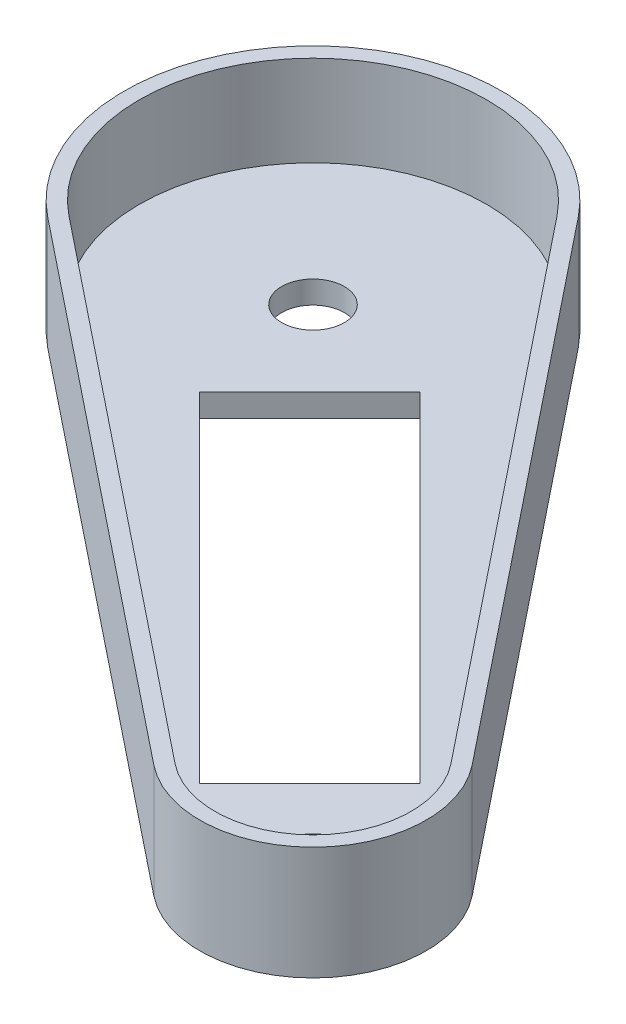
ISO-10303-21;
HEADER;
FILE_DESCRIPTION(('STEP AP214'),'2;1');
FILE_NAME('part.step','',(''),(''),'','','');
FILE_SCHEMA(('AUTOMOTIVE_DESIGN { 1 0 10303 214 1 1 1 1 }'));
ENDSEC;
DATA;
#1=APPLICATION_CONTEXT('core data for automotive mechanical design processes');
#2=APPLICATION_PROTOCOL_DEFINITION('international standard','automotive_design',2000,#1);
#3=PRODUCT_CONTEXT('',#1,'mechanical');
#4=PRODUCT('Part','Part','',(#3));
#5=PRODUCT_RELATED_PRODUCT_CATEGORY('part','',(#4));
#6=PRODUCT_DEFINITION_FORMATION('','',#4);
#7=PRODUCT_DEFINITION_CONTEXT('part definition',#1,'design');
#8=PRODUCT_DEFINITION('design','',#6,#7);
#9=PRODUCT_DEFINITION_SHAPE('','',#8);
#10=(LENGTH_UNIT() NAMED_UNIT(*) SI_UNIT(.MILLI.,.METRE.));
#11=(NAMED_UNIT(*) PLANE_ANGLE_UNIT() SI_UNIT($,.RADIAN.));
#12=(NAMED_UNIT(*) SI_UNIT($,.STERADIAN.) SOLID_ANGLE_UNIT());
#13=UNCERTAINTY_MEASURE_WITH_UNIT(LENGTH_MEASURE(1.E-05),#10,'distance_accuracy_value','');
#14=(GEOMETRIC_REPRESENTATION_CONTEXT(3) GLOBAL_UNCERTAINTY_ASSIGNED_CONTEXT((#13)) GLOBAL_UNIT_ASSIGNED_CONTEXT((#10,
#11,#12)) REPRESENTATION_CONTEXT('',''));
#15=CARTESIAN_POINT('',(0.,0.,0.));
#16=DIRECTION('',(0.,0.,1.));
#17=DIRECTION('',(1.,0.,0.));
#18=AXIS2_PLACEMENT_3D('',#15,#16,#17);
#19=CARTESIAN_POINT('',(-15.6040237198615,3.,19.5323947264538));
#20=DIRECTION('',(0.624160948794458,0.,-0.781295789058153));
#21=DIRECTION('',(-0.781295789058153,0.,-0.624160948794458));
#22=AXIS2_PLACEMENT_3D('',#19,#20,#21);
#23=PLANE('',#22);
#24=DIRECTION('',(0.781295789058153,0.,0.624160948794458));
#25=VECTOR('',#24,1.);
#26=CARTESIAN_POINT('',(-15.6040237198615,0.,19.5323947264538));
#27=LINE('',#26,#25);
#28=CARTESIAN_POINT('',(-15.6040237198615,0.,19.5323947264538));
#29=VERTEX_POINT('',#28);
#30=CARTESIAN_POINT('',(54.2771960748732,0.,75.3590471426608));
#31=VERTEX_POINT('',#30);
#32=EDGE_CURVE('E244',#29,#31,#27,.T.);
#33=ORIENTED_EDGE('',*,*,#32,.T.);
#34=DIRECTION('',(0.,-1.,0.));
#35=VECTOR('',#34,1.);
#36=CARTESIAN_POINT('',(54.2771960748732,3.,75.3590471426608));
#37=LINE('',#36,#35);
#38=CARTESIAN_POINT('',(54.2771960748732,15.,75.3590471426608));
#39=VERTEX_POINT('',#38);
#40=EDGE_CURVE('E11',#39,#31,#37,.T.);
#41=ORIENTED_EDGE('',*,*,#40,.F.);
#42=DIRECTION('',(0.781295789058153,0.,0.624160948794458));
#43=VECTOR('',#42,1.);
#44=CARTESIAN_POINT('',(-15.6040237198615,15.,19.5323947264538));
#45=LINE('',#44,#43);
#46=CARTESIAN_POINT('',(-15.6040237198615,15.,19.5323947264538));
#47=VERTEX_POINT('',#46);
#48=EDGE_CURVE('E201',#47,#39,#45,.T.);
#49=ORIENTED_EDGE('',*,*,#48,.F.);
#50=DIRECTION('',(0.,-1.,0.));
#51=VECTOR('',#50,1.);
#52=CARTESIAN_POINT('',(-15.6040237198615,3.,19.5323947264538));
#53=LINE('',#52,#51);
#54=EDGE_CURVE('E254',#47,#29,#53,.T.);
#55=ORIENTED_EDGE('',*,*,#54,.T.);
#56=EDGE_LOOP('',(#33,#41,#49,#55));
#57=FACE_BOUND('',#56,.T.);
#58=ADVANCED_FACE('F47',(#57),#23,.F.);
#59=CARTESIAN_POINT('',(63.6396103067901,3.,63.6396103067885));
#60=DIRECTION('',(0.,-1.,0.));
#61=DIRECTION('',(0.,0.,-1.));
#62=AXIS2_PLACEMENT_3D('',#59,#60,#61);
#63=CYLINDRICAL_SURFACE('',#62,15.);
#64=CARTESIAN_POINT('',(63.6396103067901,0.,63.6396103067885));
#65=DIRECTION('',(0.,1.,0.));
#66=DIRECTION('',(0.,0.,1.));
#67=AXIS2_PLACEMENT_3D('',#64,#65,#66);
#68=CIRCLE('',#67,15.);
#69=CARTESIAN_POINT('',(75.3590471426621,0.,54.2771960748713));
#70=VERTEX_POINT('',#69);
#71=EDGE_CURVE('E258',#31,#70,#68,.T.);
#72=ORIENTED_EDGE('',*,*,#71,.T.);
#73=DIRECTION('',(0.,-1.,0.));
#74=VECTOR('',#73,1.);
#75=CARTESIAN_POINT('',(75.3590471426621,3.,54.2771960748713));
#76=LINE('',#75,#74);
#77=CARTESIAN_POINT('',(75.3590471426621,15.,54.2771960748713));
#78=VERTEX_POINT('',#77);
#79=EDGE_CURVE('E55',#78,#70,#76,.T.);
#80=ORIENTED_EDGE('',*,*,#79,.F.);
#81=CARTESIAN_POINT('',(63.6396103067901,15.,63.6396103067885));
#82=DIRECTION('',(0.,1.,0.));
#83=DIRECTION('',(0.,0.,1.));
#84=AXIS2_PLACEMENT_3D('',#81,#82,#83);
#85=CIRCLE('',#84,15.);
#86=EDGE_CURVE('E205',#39,#78,#85,.T.);
#87=ORIENTED_EDGE('',*,*,#86,.F.);
#88=ORIENTED_EDGE('',*,*,#40,.T.);
#89=EDGE_LOOP('',(#72,#80,#87,#88));
#90=FACE_BOUND('',#89,.T.);
#91=ADVANCED_FACE('F288',(#90),#63,.T.);
#92=CARTESIAN_POINT('',(19.5323947264534,3.,-15.6040237198619));
#93=DIRECTION('',(0.781295789058138,0.,-0.624160948794477));
#94=DIRECTION('',(-0.624160948794477,0.,-0.781295789058138));
#95=AXIS2_PLACEMENT_3D('',#92,#93,#94);
#96=PLANE('',#95);
#97=DIRECTION('',(0.624160948794477,0.,0.781295789058138));
#98=VECTOR('',#97,1.);
#99=CARTESIAN_POINT('',(19.5323947264534,0.,-15.6040237198619));
#100=LINE('',#99,#98);
#101=CARTESIAN_POINT('',(19.5323947264534,0.,-15.6040237198619));
#102=VERTEX_POINT('',#101);
#103=EDGE_CURVE('E262',#102,#70,#100,.T.);
#104=ORIENTED_EDGE('',*,*,#103,.F.);
#105=DIRECTION('',(0.,-1.,0.));
#106=VECTOR('',#105,1.);
#107=CARTESIAN_POINT('',(19.5323947264534,3.,-15.6040237198619));
#108=LINE('',#107,#106);
#109=CARTESIAN_POINT('',(19.5323947264534,15.,-15.6040237198619));
#110=VERTEX_POINT('',#109);
#111=EDGE_CURVE('E279',#110,#102,#108,.T.);
#112=ORIENTED_EDGE('',*,*,#111,.F.);
#113=DIRECTION('',(-0.624160948794477,0.,-0.781295789058138));
#114=VECTOR('',#113,1.);
#115=CARTESIAN_POINT('',(19.5323947264534,15.,-15.6040237198619));
#116=LINE('',#115,#114);
#117=EDGE_CURVE('E209',#78,#110,#116,.T.);
#118=ORIENTED_EDGE('',*,*,#117,.F.);
#119=ORIENTED_EDGE('',*,*,#79,.T.);
#120=EDGE_LOOP('',(#104,#112,#118,#119));
#121=FACE_BOUND('',#120,.T.);
#122=ADVANCED_FACE('F285',(#121),#96,.T.);
#123=CARTESIAN_POINT('',(63.6396103067901,3.,63.6396103067885));
#124=DIRECTION('',(0.,-1.,0.));
#125=DIRECTION('',(0.,0.,-1.));
#126=AXIS2_PLACEMENT_3D('',#123,#124,#125);
#127=CYLINDRICAL_SURFACE('',#126,4.15);
#128=CARTESIAN_POINT('',(63.6396103067901,3.,63.6396103067885));
#129=DIRECTION('',(0.,1.,0.));
#130=DIRECTION('',(0.,0.,1.));
#131=AXIS2_PLACEMENT_3D('',#128,#129,#130);
#132=CIRCLE('',#131,4.15);
#133=CARTESIAN_POINT('',(63.6396103067901,3.,67.7896103067885));
#134=VERTEX_POINT('',#133);
#135=EDGE_CURVE('E245',#134,#134,#132,.T.);
#136=ORIENTED_EDGE('',*,*,#135,.T.);
#137=EDGE_LOOP('',(#136));
#138=FACE_BOUND('',#137,.T.);
#139=CARTESIAN_POINT('',(63.6396103067901,0.,63.6396103067885));
#140=DIRECTION('',(0.,1.,0.));
#141=DIRECTION('',(0.,0.,1.));
#142=AXIS2_PLACEMENT_3D('',#139,#140,#141);
#143=CIRCLE('',#142,4.15);
#144=CARTESIAN_POINT('',(63.6396103067901,0.,67.7896103067885));
#145=VERTEX_POINT('',#144);
#146=EDGE_CURVE('E269',#145,#145,#143,.T.);
#147=ORIENTED_EDGE('',*,*,#146,.F.);
#148=EDGE_LOOP('',(#147));
#149=FACE_BOUND('',#148,.T.);
#150=ADVANCED_FACE('F321',(#138,#149),#127,.F.);
#151=CARTESIAN_POINT('',(0.,3.,0.));
#152=DIRECTION('',(0.,-1.,0.));
#153=DIRECTION('',(0.,0.,-1.));
#154=AXIS2_PLACEMENT_3D('',#151,#152,#153);
#155=CYLINDRICAL_SURFACE('',#154,25.);
#156=CARTESIAN_POINT('',(0.,0.,0.));
#157=DIRECTION('',(0.,1.,0.));
#158=DIRECTION('',(0.,0.,1.));
#159=AXIS2_PLACEMENT_3D('',#156,#157,#158);
#160=CIRCLE('',#159,25.);
#161=EDGE_CURVE('E266',#102,#29,#160,.T.);
#162=ORIENTED_EDGE('',*,*,#161,.T.);
#163=ORIENTED_EDGE('',*,*,#54,.F.);
#164=CARTESIAN_POINT('',(0.,15.,0.));
#165=DIRECTION('',(0.,1.,0.));
#166=DIRECTION('',(0.,0.,1.));
#167=AXIS2_PLACEMENT_3D('',#164,#165,#166);
#168=CIRCLE('',#167,25.);
#169=EDGE_CURVE('E213',#110,#47,#168,.T.);
#170=ORIENTED_EDGE('',*,*,#169,.F.);
#171=ORIENTED_EDGE('',*,*,#111,.T.);
#172=EDGE_LOOP('',(#162,#163,#170,#171));
#173=FACE_BOUND('',#172,.T.);
#174=ADVANCED_FACE('F293',(#173),#155,.T.);
#175=CARTESIAN_POINT('',(0.,3.,0.));
#176=DIRECTION('',(0.,-1.,0.));
#177=DIRECTION('',(0.,0.,-1.));
#178=AXIS2_PLACEMENT_3D('',#175,#176,#177);
#179=CYLINDRICAL_SURFACE('',#178,4.15);
#180=CARTESIAN_POINT('',(0.,3.,0.));
#181=DIRECTION('',(0.,1.,0.));
#182=DIRECTION('',(0.,0.,1.));
#183=AXIS2_PLACEMENT_3D('',#180,#181,#182);
#184=CIRCLE('',#183,4.15);
#185=CARTESIAN_POINT('',(0.,3.,4.15));
#186=VERTEX_POINT('',#185);
#187=EDGE_CURVE('E249',#186,#186,#184,.T.);
#188=ORIENTED_EDGE('',*,*,#187,.T.);
#189=EDGE_LOOP('',(#188));
#190=FACE_BOUND('',#189,.T.);
#191=CARTESIAN_POINT('',(0.,0.,0.));
#192=DIRECTION('',(0.,1.,0.));
#193=DIRECTION('',(0.,0.,1.));
#194=AXIS2_PLACEMENT_3D('',#191,#192,#193);
#195=CIRCLE('',#194,4.15);
#196=CARTESIAN_POINT('',(0.,0.,4.15));
#197=VERTEX_POINT('',#196);
#198=EDGE_CURVE('E250',#197,#197,#195,.T.);
#199=ORIENTED_EDGE('',*,*,#198,.F.);
#200=EDGE_LOOP('',(#199));
#201=FACE_BOUND('',#200,.T.);
#202=ADVANCED_FACE('F326',(#190,#201),#179,.F.);
#203=CARTESIAN_POINT('',(0.,3.,0.));
#204=DIRECTION('',(0.,1.,0.));
#205=DIRECTION('',(0.,0.,1.));
#206=AXIS2_PLACEMENT_3D('',#203,#204,#205);
#207=PLANE('',#206);
#208=DIRECTION('',(-0.707106781186556,0.,-0.707106781186539));
#209=VECTOR('',#208,1.);
#210=CARTESIAN_POINT('',(7.07833510875965,3.,-7.07833510875982));
#211=LINE('',#210,#209);
#212=CARTESIAN_POINT('',(61.9879543253394,3.,47.8312841078186));
#213=VERTEX_POINT('',#212);
#214=CARTESIAN_POINT('',(17.1336623729859,3.,2.97699215546623));
#215=VERTEX_POINT('',#214);
#216=EDGE_CURVE('E62',#213,#215,#211,.T.);
#217=ORIENTED_EDGE('',*,*,#216,.F.);
#218=DIRECTION('',(0.707106781186539,0.,-0.707106781186556));
#219=VECTOR('',#218,1.);
#220=CARTESIAN_POINT('',(54.9096192165797,3.,54.9096192165784));
#221=LINE('',#220,#219);
#222=CARTESIAN_POINT('',(47.3842313641089,3.,62.4350070690494));
#223=VERTEX_POINT('',#222);
#224=EDGE_CURVE('E157',#223,#213,#221,.T.);
#225=ORIENTED_EDGE('',*,*,#224,.F.);
#226=DIRECTION('',(0.707106781186556,0.,0.707106781186539));
#227=VECTOR('',#226,1.);
#228=CARTESIAN_POINT('',(-7.52538785247084,3.,7.52538785247103));
#229=LINE('',#228,#227);
#230=CARTESIAN_POINT('',(2.52993941175545,3.,17.5807151166971));
#231=VERTEX_POINT('',#230);
#232=EDGE_CURVE('E161',#231,#223,#229,.T.);
#233=ORIENTED_EDGE('',*,*,#232,.F.);
#234=DIRECTION('',(-0.707106781186539,0.,0.707106781186556));
#235=VECTOR('',#234,1.);
#236=CARTESIAN_POINT('',(10.0553272642263,3.,10.055327264226));
#237=LINE('',#236,#235);
#238=EDGE_CURVE('E170',#215,#231,#237,.T.);
#239=ORIENTED_EDGE('',*,*,#238,.F.);
#240=EDGE_LOOP('',(#217,#225,#233,#239));
#241=FACE_BOUND('',#240,.T.);
#242=CARTESIAN_POINT('',(63.6396103067901,3.,63.6396103067885));
#243=DIRECTION('',(0.,1.,0.));
#244=DIRECTION('',(0.,0.,1.));
#245=AXIS2_PLACEMENT_3D('',#242,#243,#244);
#246=CIRCLE('',#245,13.);
#247=CARTESIAN_POINT('',(55.5255179724621,3.,73.7964555645445));
#248=VERTEX_POINT('',#247);
#249=CARTESIAN_POINT('',(73.7964555645458,3.,55.5255179724603));
#250=VERTEX_POINT('',#249);
#251=EDGE_CURVE('E221',#248,#250,#246,.T.);
#252=ORIENTED_EDGE('',*,*,#251,.T.);
#253=DIRECTION('',(0.624160948794477,0.,0.781295789058138));
#254=VECTOR('',#253,1.);
#255=CARTESIAN_POINT('',(17.9698031483372,3.,-14.355701822273));
#256=LINE('',#255,#254);
#257=CARTESIAN_POINT('',(17.9698031483372,3.,-14.355701822273));
#258=VERTEX_POINT('',#257);
#259=EDGE_CURVE('E179',#258,#250,#256,.T.);
#260=ORIENTED_EDGE('',*,*,#259,.F.);
#261=CARTESIAN_POINT('',(0.,3.,0.));
#262=DIRECTION('',(0.,1.,0.));
#263=DIRECTION('',(0.,0.,1.));
#264=AXIS2_PLACEMENT_3D('',#261,#262,#263);
#265=CIRCLE('',#264,23.);
#266=CARTESIAN_POINT('',(-14.3557018222725,3.,17.9698031483375));
#267=VERTEX_POINT('',#266);
#268=EDGE_CURVE('E189',#258,#267,#265,.T.);
#269=ORIENTED_EDGE('',*,*,#268,.T.);
#270=DIRECTION('',(0.781295789058153,0.,0.624160948794458));
#271=VECTOR('',#270,1.);
#272=CARTESIAN_POINT('',(-14.3557018222725,3.,17.9698031483375));
#273=LINE('',#272,#271);
#274=EDGE_CURVE('E224',#267,#248,#273,.T.);
#275=ORIENTED_EDGE('',*,*,#274,.T.);
#276=EDGE_LOOP('',(#252,#260,#269,#275));
#277=FACE_BOUND('',#276,.T.);
#278=ORIENTED_EDGE('',*,*,#135,.F.);
#279=EDGE_LOOP('',(#278));
#280=FACE_BOUND('',#279,.T.);
#281=ORIENTED_EDGE('',*,*,#187,.F.);
#282=EDGE_LOOP('',(#281));
#283=FACE_BOUND('',#282,.T.);
#284=ADVANCED_FACE('F331',(#241,#277,#280,#283),#207,.T.);
#285=CARTESIAN_POINT('',(0.,0.,0.));
#286=DIRECTION('',(0.,1.,0.));
#287=DIRECTION('',(0.,0.,1.));
#288=AXIS2_PLACEMENT_3D('',#285,#286,#287);
#289=PLANE('',#288);
#290=DIRECTION('',(0.707106781186539,0.,-0.707106781186556));
#291=VECTOR('',#290,1.);
#292=CARTESIAN_POINT('',(54.9096192165797,0.,54.9096192165784));
#293=LINE('',#292,#291);
#294=CARTESIAN_POINT('',(47.3842313641089,0.,62.4350070690494));
#295=VERTEX_POINT('',#294);
#296=CARTESIAN_POINT('',(61.9879543253394,0.,47.8312841078186));
#297=VERTEX_POINT('',#296);
#298=EDGE_CURVE('E145',#295,#297,#293,.T.);
#299=ORIENTED_EDGE('',*,*,#298,.T.);
#300=DIRECTION('',(-0.707106781186556,0.,-0.707106781186539));
#301=VECTOR('',#300,1.);
#302=CARTESIAN_POINT('',(7.07833510875965,0.,-7.07833510875982));
#303=LINE('',#302,#301);
#304=CARTESIAN_POINT('',(17.1336623729859,0.,2.97699215546623));
#305=VERTEX_POINT('',#304);
#306=EDGE_CURVE('E138',#297,#305,#303,.T.);
#307=ORIENTED_EDGE('',*,*,#306,.T.);
#308=DIRECTION('',(-0.707106781186539,0.,0.707106781186556));
#309=VECTOR('',#308,1.);
#310=CARTESIAN_POINT('',(10.0553272642263,0.,10.055327264226));
#311=LINE('',#310,#309);
#312=CARTESIAN_POINT('',(2.52993941175545,0.,17.5807151166971));
#313=VERTEX_POINT('',#312);
#314=EDGE_CURVE('E148',#305,#313,#311,.T.);
#315=ORIENTED_EDGE('',*,*,#314,.T.);
#316=DIRECTION('',(0.707106781186556,0.,0.707106781186539));
#317=VECTOR('',#316,1.);
#318=CARTESIAN_POINT('',(-7.52538785247084,0.,7.52538785247103));
#319=LINE('',#318,#317);
#320=EDGE_CURVE('E70',#313,#295,#319,.T.);
#321=ORIENTED_EDGE('',*,*,#320,.T.);
#322=EDGE_LOOP('',(#299,#307,#315,#321));
#323=FACE_BOUND('',#322,.T.);
#324=ORIENTED_EDGE('',*,*,#32,.F.);
#325=ORIENTED_EDGE('',*,*,#161,.F.);
#326=ORIENTED_EDGE('',*,*,#103,.T.);
#327=ORIENTED_EDGE('',*,*,#71,.F.);
#328=EDGE_LOOP('',(#324,#325,#326,#327));
#329=FACE_BOUND('',#328,.T.);
#330=ORIENTED_EDGE('',*,*,#146,.T.);
#331=EDGE_LOOP('',(#330));
#332=FACE_BOUND('',#331,.T.);
#333=ORIENTED_EDGE('',*,*,#198,.T.);
#334=EDGE_LOOP('',(#333));
#335=FACE_BOUND('',#334,.T.);
#336=ADVANCED_FACE('F153',(#323,#329,#332,#335),#289,.F.);
#337=CARTESIAN_POINT('',(17.9698031483372,15.,-14.355701822273));
#338=DIRECTION('',(0.781295789058137,0.,-0.624160948794477));
#339=DIRECTION('',(-0.624160948794477,0.,-0.781295789058137));
#340=AXIS2_PLACEMENT_3D('',#337,#338,#339);
#341=PLANE('',#340);
#342=ORIENTED_EDGE('',*,*,#259,.T.);
#343=DIRECTION('',(0.,-1.,0.));
#344=VECTOR('',#343,1.);
#345=CARTESIAN_POINT('',(73.7964555645459,15.,55.5255179724603));
#346=LINE('',#345,#344);
#347=CARTESIAN_POINT('',(73.7964555645459,15.,55.5255179724603));
#348=VERTEX_POINT('',#347);
#349=EDGE_CURVE('E240',#348,#250,#346,.T.);
#350=ORIENTED_EDGE('',*,*,#349,.F.);
#351=DIRECTION('',(0.624160948794477,0.,0.781295789058138));
#352=VECTOR('',#351,1.);
#353=CARTESIAN_POINT('',(17.9698031483372,15.,-14.355701822273));
#354=LINE('',#353,#352);
#355=CARTESIAN_POINT('',(17.9698031483372,15.,-14.355701822273));
#356=VERTEX_POINT('',#355);
#357=EDGE_CURVE('E185',#356,#348,#354,.T.);
#358=ORIENTED_EDGE('',*,*,#357,.F.);
#359=DIRECTION('',(0.,-1.,0.));
#360=VECTOR('',#359,1.);
#361=CARTESIAN_POINT('',(17.9698031483372,15.,-14.355701822273));
#362=LINE('',#361,#360);
#363=EDGE_CURVE('E217',#356,#258,#362,.T.);
#364=ORIENTED_EDGE('',*,*,#363,.T.);
#365=EDGE_LOOP('',(#342,#350,#358,#364));
#366=FACE_BOUND('',#365,.T.);
#367=ADVANCED_FACE('F335',(#366),#341,.F.);
#368=CARTESIAN_POINT('',(63.6396103067901,15.,63.6396103067885));
#369=DIRECTION('',(0.,-1.,0.));
#370=DIRECTION('',(0.,0.,-1.));
#371=AXIS2_PLACEMENT_3D('',#368,#369,#370);
#372=CYLINDRICAL_SURFACE('',#371,13.);
#373=ORIENTED_EDGE('',*,*,#251,.F.);
#374=DIRECTION('',(0.,-1.,0.));
#375=VECTOR('',#374,1.);
#376=CARTESIAN_POINT('',(55.5255179724621,15.,73.7964555645445));
#377=LINE('',#376,#375);
#378=CARTESIAN_POINT('',(55.5255179724621,15.,73.7964555645445));
#379=VERTEX_POINT('',#378);
#380=EDGE_CURVE('E236',#379,#248,#377,.T.);
#381=ORIENTED_EDGE('',*,*,#380,.F.);
#382=CARTESIAN_POINT('',(63.6396103067901,15.,63.6396103067885));
#383=DIRECTION('',(0.,1.,0.));
#384=DIRECTION('',(0.,0.,1.));
#385=AXIS2_PLACEMENT_3D('',#382,#383,#384);
#386=CIRCLE('',#385,13.);
#387=EDGE_CURVE('E188',#379,#348,#386,.T.);
#388=ORIENTED_EDGE('',*,*,#387,.T.);
#389=ORIENTED_EDGE('',*,*,#349,.T.);
#390=EDGE_LOOP('',(#373,#381,#388,#389));
#391=FACE_BOUND('',#390,.T.);
#392=ADVANCED_FACE('F340',(#391),#372,.F.);
#393=CARTESIAN_POINT('',(-14.3557018222725,15.,17.9698031483375));
#394=DIRECTION('',(0.624160948794458,0.,-0.781295789058153));
#395=DIRECTION('',(-0.781295789058153,0.,-0.624160948794458));
#396=AXIS2_PLACEMENT_3D('',#393,#394,#395);
#397=PLANE('',#396);
#398=ORIENTED_EDGE('',*,*,#274,.F.);
#399=DIRECTION('',(0.,-1.,0.));
#400=VECTOR('',#399,1.);
#401=CARTESIAN_POINT('',(-14.3557018222725,15.,17.9698031483375));
#402=LINE('',#401,#400);
#403=CARTESIAN_POINT('',(-14.3557018222725,15.,17.9698031483375));
#404=VERTEX_POINT('',#403);
#405=EDGE_CURVE('E232',#404,#267,#402,.T.);
#406=ORIENTED_EDGE('',*,*,#405,.F.);
#407=DIRECTION('',(0.781295789058153,0.,0.624160948794458));
#408=VECTOR('',#407,1.);
#409=CARTESIAN_POINT('',(-14.3557018222725,15.,17.9698031483375));
#410=LINE('',#409,#408);
#411=EDGE_CURVE('E193',#404,#379,#410,.T.);
#412=ORIENTED_EDGE('',*,*,#411,.T.);
#413=ORIENTED_EDGE('',*,*,#380,.T.);
#414=EDGE_LOOP('',(#398,#406,#412,#413));
#415=FACE_BOUND('',#414,.T.);
#416=ADVANCED_FACE('F310',(#415),#397,.T.);
#417=CARTESIAN_POINT('',(0.,15.,0.));
#418=DIRECTION('',(0.,-1.,0.));
#419=DIRECTION('',(0.,0.,-1.));
#420=AXIS2_PLACEMENT_3D('',#417,#418,#419);
#421=CYLINDRICAL_SURFACE('',#420,23.);
#422=ORIENTED_EDGE('',*,*,#268,.F.);
#423=ORIENTED_EDGE('',*,*,#363,.F.);
#424=CARTESIAN_POINT('',(0.,15.,0.));
#425=DIRECTION('',(0.,1.,0.));
#426=DIRECTION('',(0.,0.,1.));
#427=AXIS2_PLACEMENT_3D('',#424,#425,#426);
#428=CIRCLE('',#427,23.);
#429=EDGE_CURVE('E197',#356,#404,#428,.T.);
#430=ORIENTED_EDGE('',*,*,#429,.T.);
#431=ORIENTED_EDGE('',*,*,#405,.T.);
#432=EDGE_LOOP('',(#422,#423,#430,#431));
#433=FACE_BOUND('',#432,.T.);
#434=ADVANCED_FACE('F300',(#433),#421,.F.);
#435=CARTESIAN_POINT('',(0.,15.,0.));
#436=DIRECTION('',(0.,1.,0.));
#437=DIRECTION('',(0.,0.,1.));
#438=AXIS2_PLACEMENT_3D('',#435,#436,#437);
#439=PLANE('',#438);
#440=ORIENTED_EDGE('',*,*,#357,.T.);
#441=ORIENTED_EDGE('',*,*,#387,.F.);
#442=ORIENTED_EDGE('',*,*,#411,.F.);
#443=ORIENTED_EDGE('',*,*,#429,.F.);
#444=EDGE_LOOP('',(#440,#441,#442,#443));
#445=FACE_BOUND('',#444,.T.);
#446=ORIENTED_EDGE('',*,*,#48,.T.);
#447=ORIENTED_EDGE('',*,*,#86,.T.);
#448=ORIENTED_EDGE('',*,*,#117,.T.);
#449=ORIENTED_EDGE('',*,*,#169,.T.);
#450=EDGE_LOOP('',(#446,#447,#448,#449));
#451=FACE_BOUND('',#450,.T.);
#452=ADVANCED_FACE('F298',(#445,#451),#439,.T.);
#453=CARTESIAN_POINT('',(7.07833510875965,0.,-7.07833510875982));
#454=DIRECTION('',(0.707106781186539,0.,-0.707106781186556));
#455=DIRECTION('',(-0.707106781186556,0.,-0.707106781186539));
#456=AXIS2_PLACEMENT_3D('',#453,#454,#455);
#457=PLANE('',#456);
#458=ORIENTED_EDGE('',*,*,#216,.T.);
#459=DIRECTION('',(0.,1.,0.));
#460=VECTOR('',#459,1.);
#461=CARTESIAN_POINT('',(17.1336623729859,0.,2.97699215546623));
#462=LINE('',#461,#460);
#463=EDGE_CURVE('E134',#305,#215,#462,.T.);
#464=ORIENTED_EDGE('',*,*,#463,.F.);
#465=ORIENTED_EDGE('',*,*,#306,.F.);
#466=DIRECTION('',(0.,1.,0.));
#467=VECTOR('',#466,1.);
#468=CARTESIAN_POINT('',(61.9879543253394,0.,47.8312841078186));
#469=LINE('',#468,#467);
#470=EDGE_CURVE('E176',#297,#213,#469,.T.);
#471=ORIENTED_EDGE('',*,*,#470,.T.);
#472=EDGE_LOOP('',(#458,#464,#465,#471));
#473=FACE_BOUND('',#472,.T.);
#474=ADVANCED_FACE('F136',(#473),#457,.F.);
#475=CARTESIAN_POINT('',(54.9096192165797,0.,54.9096192165784));
#476=DIRECTION('',(0.707106781186556,0.,0.707106781186539));
#477=DIRECTION('',(0.707106781186539,0.,-0.707106781186556));
#478=AXIS2_PLACEMENT_3D('',#475,#476,#477);
#479=PLANE('',#478);
#480=ORIENTED_EDGE('',*,*,#224,.T.);
#481=ORIENTED_EDGE('',*,*,#470,.F.);
#482=ORIENTED_EDGE('',*,*,#298,.F.);
#483=DIRECTION('',(0.,1.,0.));
#484=VECTOR('',#483,1.);
#485=CARTESIAN_POINT('',(47.3842313641089,0.,62.4350070690494));
#486=LINE('',#485,#484);
#487=EDGE_CURVE('E180',#295,#223,#486,.T.);
#488=ORIENTED_EDGE('',*,*,#487,.T.);
#489=EDGE_LOOP('',(#480,#481,#482,#488));
#490=FACE_BOUND('',#489,.T.);
#491=ADVANCED_FACE('F308',(#490),#479,.F.);
#492=CARTESIAN_POINT('',(-7.52538785247084,0.,7.52538785247103));
#493=DIRECTION('',(-0.707106781186539,0.,0.707106781186556));
#494=DIRECTION('',(0.707106781186556,0.,0.707106781186539));
#495=AXIS2_PLACEMENT_3D('',#492,#493,#494);
#496=PLANE('',#495);
#497=ORIENTED_EDGE('',*,*,#232,.T.);
#498=ORIENTED_EDGE('',*,*,#487,.F.);
#499=ORIENTED_EDGE('',*,*,#320,.F.);
#500=DIRECTION('',(0.,1.,0.));
#501=VECTOR('',#500,1.);
#502=CARTESIAN_POINT('',(2.52993941175545,0.,17.5807151166971));
#503=LINE('',#502,#501);
#504=EDGE_CURVE('E144',#313,#231,#503,.T.);
#505=ORIENTED_EDGE('',*,*,#504,.T.);
#506=EDGE_LOOP('',(#497,#498,#499,#505));
#507=FACE_BOUND('',#506,.T.);
#508=ADVANCED_FACE('F403',(#507),#496,.F.);
#509=CARTESIAN_POINT('',(10.0553272642263,0.,10.055327264226));
#510=DIRECTION('',(-0.707106781186556,0.,-0.707106781186539));
#511=DIRECTION('',(-0.707106781186539,0.,0.707106781186556));
#512=AXIS2_PLACEMENT_3D('',#509,#510,#511);
#513=PLANE('',#512);
#514=ORIENTED_EDGE('',*,*,#238,.T.);
#515=ORIENTED_EDGE('',*,*,#504,.F.);
#516=ORIENTED_EDGE('',*,*,#314,.F.);
#517=ORIENTED_EDGE('',*,*,#463,.T.);
#518=EDGE_LOOP('',(#514,#515,#516,#517));
#519=FACE_BOUND('',#518,.T.);
#520=ADVANCED_FACE('F149',(#519),#513,.F.);
#521=CLOSED_SHELL('',(#58,#91,#122,#150,#174,#202,#284,#336,#367,#392,#416,#434,#452,#474,#491,
#508,#520));
#522=MANIFOLD_SOLID_BREP('B2',#521);
#523=ADVANCED_BREP_SHAPE_REPRESENTATION('',(#18,#522),#14);
#524=SHAPE_DEFINITION_REPRESENTATION(#9,#523);
ENDSEC;
END-ISO-10303-21;
